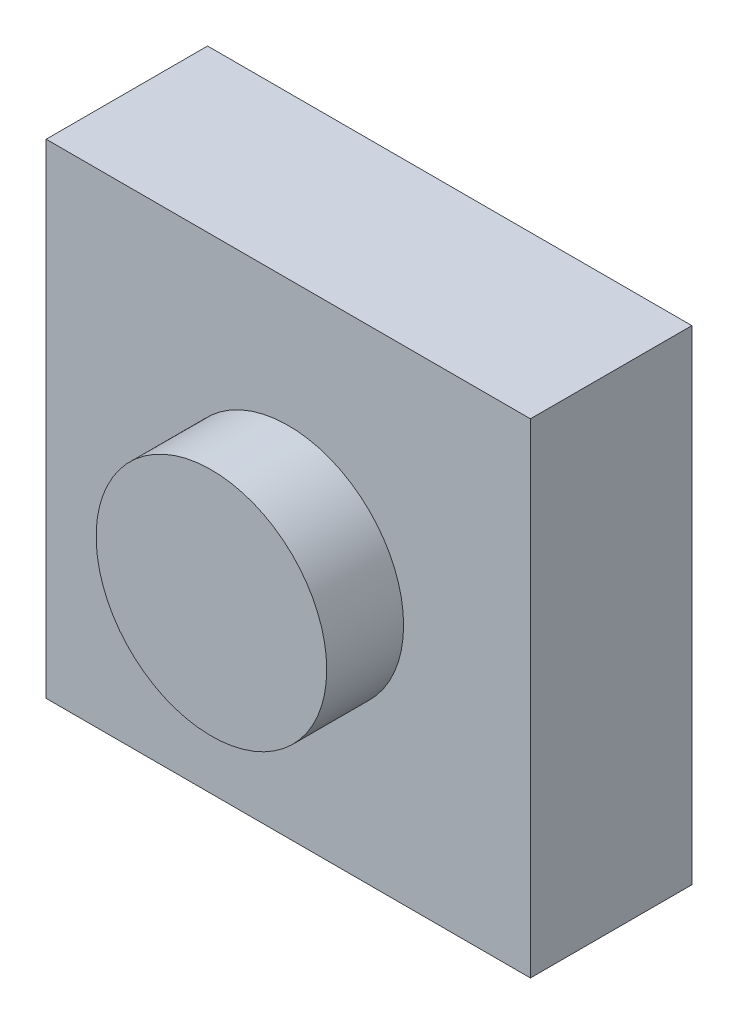
ISO-10303-21;
HEADER;
FILE_DESCRIPTION(('STEP AP214'),'2;1');
FILE_NAME('part.step','',(''),(''),'','','');
FILE_SCHEMA(('AUTOMOTIVE_DESIGN { 1 0 10303 214 1 1 1 1 }'));
ENDSEC;
DATA;
#1=APPLICATION_CONTEXT('core data for automotive mechanical design processes');
#2=APPLICATION_PROTOCOL_DEFINITION('international standard','automotive_design',2000,#1);
#3=PRODUCT_CONTEXT('',#1,'mechanical');
#4=PRODUCT('Part','Part','',(#3));
#5=PRODUCT_RELATED_PRODUCT_CATEGORY('part','',(#4));
#6=PRODUCT_DEFINITION_FORMATION('','',#4);
#7=PRODUCT_DEFINITION_CONTEXT('part definition',#1,'design');
#8=PRODUCT_DEFINITION('design','',#6,#7);
#9=PRODUCT_DEFINITION_SHAPE('','',#8);
#10=(LENGTH_UNIT() NAMED_UNIT(*) SI_UNIT(.MILLI.,.METRE.));
#11=(NAMED_UNIT(*) PLANE_ANGLE_UNIT() SI_UNIT($,.RADIAN.));
#12=(NAMED_UNIT(*) SI_UNIT($,.STERADIAN.) SOLID_ANGLE_UNIT());
#13=UNCERTAINTY_MEASURE_WITH_UNIT(LENGTH_MEASURE(1.E-05),#10,'distance_accuracy_value','');
#14=(GEOMETRIC_REPRESENTATION_CONTEXT(3) GLOBAL_UNCERTAINTY_ASSIGNED_CONTEXT((#13)) GLOBAL_UNIT_ASSIGNED_CONTEXT((#10,
#11,#12)) REPRESENTATION_CONTEXT('',''));
#15=CARTESIAN_POINT('',(0.,0.,0.));
#16=DIRECTION('',(0.,0.,1.));
#17=DIRECTION('',(1.,0.,0.));
#18=AXIS2_PLACEMENT_3D('',#15,#16,#17);
#19=CARTESIAN_POINT('',(-3.15,-3.15,2.1));
#20=DIRECTION('',(1.,0.,0.));
#21=DIRECTION('',(0.,0.,-1.));
#22=AXIS2_PLACEMENT_3D('',#19,#20,#21);
#23=PLANE('',#22);
#24=DIRECTION('',(0.,-1.,0.));
#25=VECTOR('',#24,1.);
#26=CARTESIAN_POINT('',(-3.15,-3.15,0.));
#27=LINE('',#26,#25);
#28=CARTESIAN_POINT('',(-3.15,3.15,0.));
#29=VERTEX_POINT('',#28);
#30=CARTESIAN_POINT('',(-3.15,-3.15,0.));
#31=VERTEX_POINT('',#30);
#32=EDGE_CURVE('E110',#29,#31,#27,.T.);
#33=ORIENTED_EDGE('',*,*,#32,.T.);
#34=DIRECTION('',(0.,0.,-1.));
#35=VECTOR('',#34,1.);
#36=CARTESIAN_POINT('',(-3.15,-3.15,2.1));
#37=LINE('',#36,#35);
#38=CARTESIAN_POINT('',(-3.15,-3.15,2.1));
#39=VERTEX_POINT('',#38);
#40=EDGE_CURVE('E42',#39,#31,#37,.T.);
#41=ORIENTED_EDGE('',*,*,#40,.F.);
#42=DIRECTION('',(0.,-1.,0.));
#43=VECTOR('',#42,1.);
#44=CARTESIAN_POINT('',(-3.15,-3.15,2.1));
#45=LINE('',#44,#43);
#46=CARTESIAN_POINT('',(-3.15,3.15,2.1));
#47=VERTEX_POINT('',#46);
#48=EDGE_CURVE('E93',#47,#39,#45,.T.);
#49=ORIENTED_EDGE('',*,*,#48,.F.);
#50=DIRECTION('',(0.,0.,-1.));
#51=VECTOR('',#50,1.);
#52=CARTESIAN_POINT('',(-3.15,3.15,2.1));
#53=LINE('',#52,#51);
#54=EDGE_CURVE('E106',#47,#29,#53,.T.);
#55=ORIENTED_EDGE('',*,*,#54,.T.);
#56=EDGE_LOOP('',(#33,#41,#49,#55));
#57=FACE_BOUND('',#56,.T.);
#58=ADVANCED_FACE('F39',(#57),#23,.F.);
#59=CARTESIAN_POINT('',(3.15,-3.15,2.1));
#60=DIRECTION('',(0.,1.,0.));
#61=DIRECTION('',(-1.,0.,0.));
#62=AXIS2_PLACEMENT_3D('',#59,#60,#61);
#63=PLANE('',#62);
#64=DIRECTION('',(1.,0.,0.));
#65=VECTOR('',#64,1.);
#66=CARTESIAN_POINT('',(3.15,-3.15,0.));
#67=LINE('',#66,#65);
#68=CARTESIAN_POINT('',(3.15,-3.15,0.));
#69=VERTEX_POINT('',#68);
#70=EDGE_CURVE('E99',#31,#69,#67,.T.);
#71=ORIENTED_EDGE('',*,*,#70,.T.);
#72=DIRECTION('',(0.,0.,-1.));
#73=VECTOR('',#72,1.);
#74=CARTESIAN_POINT('',(3.15,-3.15,2.1));
#75=LINE('',#74,#73);
#76=CARTESIAN_POINT('',(3.15,-3.15,2.1));
#77=VERTEX_POINT('',#76);
#78=EDGE_CURVE('E97',#77,#69,#75,.T.);
#79=ORIENTED_EDGE('',*,*,#78,.F.);
#80=DIRECTION('',(1.,0.,0.));
#81=VECTOR('',#80,1.);
#82=CARTESIAN_POINT('',(3.15,-3.15,2.1));
#83=LINE('',#82,#81);
#84=EDGE_CURVE('E88',#39,#77,#83,.T.);
#85=ORIENTED_EDGE('',*,*,#84,.F.);
#86=ORIENTED_EDGE('',*,*,#40,.T.);
#87=EDGE_LOOP('',(#71,#79,#85,#86));
#88=FACE_BOUND('',#87,.T.);
#89=ADVANCED_FACE('F98',(#88),#63,.F.);
#90=CARTESIAN_POINT('',(3.15,-3.15,2.1));
#91=DIRECTION('',(-1.,0.,0.));
#92=DIRECTION('',(0.,0.,1.));
#93=AXIS2_PLACEMENT_3D('',#90,#91,#92);
#94=PLANE('',#93);
#95=DIRECTION('',(0.,1.,0.));
#96=VECTOR('',#95,1.);
#97=CARTESIAN_POINT('',(3.15,-3.15,0.));
#98=LINE('',#97,#96);
#99=CARTESIAN_POINT('',(3.15,3.15,0.));
#100=VERTEX_POINT('',#99);
#101=EDGE_CURVE('E74',#69,#100,#98,.T.);
#102=ORIENTED_EDGE('',*,*,#101,.T.);
#103=DIRECTION('',(0.,0.,-1.));
#104=VECTOR('',#103,1.);
#105=CARTESIAN_POINT('',(3.15,3.15,2.1));
#106=LINE('',#105,#104);
#107=CARTESIAN_POINT('',(3.15,3.15,2.1));
#108=VERTEX_POINT('',#107);
#109=EDGE_CURVE('E101',#108,#100,#106,.T.);
#110=ORIENTED_EDGE('',*,*,#109,.F.);
#111=DIRECTION('',(0.,1.,0.));
#112=VECTOR('',#111,1.);
#113=CARTESIAN_POINT('',(3.15,-3.15,2.1));
#114=LINE('',#113,#112);
#115=EDGE_CURVE('E91',#77,#108,#114,.T.);
#116=ORIENTED_EDGE('',*,*,#115,.F.);
#117=ORIENTED_EDGE('',*,*,#78,.T.);
#118=EDGE_LOOP('',(#102,#110,#116,#117));
#119=FACE_BOUND('',#118,.T.);
#120=ADVANCED_FACE('F102',(#119),#94,.F.);
#121=CARTESIAN_POINT('',(3.15,3.15,2.1));
#122=DIRECTION('',(0.,-1.,0.));
#123=DIRECTION('',(1.,0.,0.));
#124=AXIS2_PLACEMENT_3D('',#121,#122,#123);
#125=PLANE('',#124);
#126=DIRECTION('',(-1.,0.,0.));
#127=VECTOR('',#126,1.);
#128=CARTESIAN_POINT('',(3.15,3.15,0.));
#129=LINE('',#128,#127);
#130=EDGE_CURVE('E80',#100,#29,#129,.T.);
#131=ORIENTED_EDGE('',*,*,#130,.T.);
#132=ORIENTED_EDGE('',*,*,#54,.F.);
#133=DIRECTION('',(-1.,0.,0.));
#134=VECTOR('',#133,1.);
#135=CARTESIAN_POINT('',(3.15,3.15,2.1));
#136=LINE('',#135,#134);
#137=EDGE_CURVE('E57',#108,#47,#136,.T.);
#138=ORIENTED_EDGE('',*,*,#137,.F.);
#139=ORIENTED_EDGE('',*,*,#109,.T.);
#140=EDGE_LOOP('',(#131,#132,#138,#139));
#141=FACE_BOUND('',#140,.T.);
#142=ADVANCED_FACE('F124',(#141),#125,.F.);
#143=CARTESIAN_POINT('',(0.,0.,2.1));
#144=DIRECTION('',(0.,0.,1.));
#145=DIRECTION('',(1.,0.,0.));
#146=AXIS2_PLACEMENT_3D('',#143,#144,#145);
#147=PLANE('',#146);
#148=CARTESIAN_POINT('',(0.,0.,2.1));
#149=DIRECTION('',(0.,0.,1.));
#150=DIRECTION('',(1.,0.,0.));
#151=AXIS2_PLACEMENT_3D('',#148,#149,#150);
#152=CIRCLE('',#151,1.5);
#153=CARTESIAN_POINT('',(1.5,0.,2.1));
#154=VERTEX_POINT('',#153);
#155=EDGE_CURVE('E11',#154,#154,#152,.T.);
#156=ORIENTED_EDGE('',*,*,#155,.F.);
#157=EDGE_LOOP('',(#156));
#158=FACE_BOUND('',#157,.T.);
#159=ORIENTED_EDGE('',*,*,#48,.T.);
#160=ORIENTED_EDGE('',*,*,#84,.T.);
#161=ORIENTED_EDGE('',*,*,#115,.T.);
#162=ORIENTED_EDGE('',*,*,#137,.T.);
#163=EDGE_LOOP('',(#159,#160,#161,#162));
#164=FACE_BOUND('',#163,.T.);
#165=ADVANCED_FACE('F89',(#158,#164),#147,.T.);
#166=CARTESIAN_POINT('',(0.,0.,0.));
#167=DIRECTION('',(0.,0.,1.));
#168=DIRECTION('',(1.,0.,0.));
#169=AXIS2_PLACEMENT_3D('',#166,#167,#168);
#170=PLANE('',#169);
#171=ORIENTED_EDGE('',*,*,#32,.F.);
#172=ORIENTED_EDGE('',*,*,#130,.F.);
#173=ORIENTED_EDGE('',*,*,#101,.F.);
#174=ORIENTED_EDGE('',*,*,#70,.F.);
#175=EDGE_LOOP('',(#171,#172,#173,#174));
#176=FACE_BOUND('',#175,.T.);
#177=ADVANCED_FACE('F127',(#176),#170,.F.);
#178=CARTESIAN_POINT('',(0.,0.,3.1));
#179=DIRECTION('',(0.,0.,-1.));
#180=DIRECTION('',(-1.,0.,0.));
#181=AXIS2_PLACEMENT_3D('',#178,#179,#180);
#182=CYLINDRICAL_SURFACE('',#181,1.5);
#183=CARTESIAN_POINT('',(0.,0.,3.1));
#184=DIRECTION('',(0.,0.,1.));
#185=DIRECTION('',(1.,0.,0.));
#186=AXIS2_PLACEMENT_3D('',#183,#184,#185);
#187=CIRCLE('',#186,1.5);
#188=CARTESIAN_POINT('',(1.5,0.,3.1));
#189=VERTEX_POINT('',#188);
#190=EDGE_CURVE('E114',#189,#189,#187,.T.);
#191=ORIENTED_EDGE('',*,*,#190,.F.);
#192=EDGE_LOOP('',(#191));
#193=FACE_BOUND('',#192,.T.);
#194=ORIENTED_EDGE('',*,*,#155,.T.);
#195=EDGE_LOOP('',(#194));
#196=FACE_BOUND('',#195,.T.);
#197=ADVANCED_FACE('F137',(#193,#196),#182,.T.);
#198=CARTESIAN_POINT('',(0.,0.,3.1));
#199=DIRECTION('',(0.,0.,1.));
#200=DIRECTION('',(1.,0.,0.));
#201=AXIS2_PLACEMENT_3D('',#198,#199,#200);
#202=PLANE('',#201);
#203=ORIENTED_EDGE('',*,*,#190,.T.);
#204=EDGE_LOOP('',(#203));
#205=FACE_BOUND('',#204,.T.);
#206=ADVANCED_FACE('F135',(#205),#202,.T.);
#207=CLOSED_SHELL('',(#58,#89,#120,#142,#165,#177,#197,#206));
#208=MANIFOLD_SOLID_BREP('B2',#207);
#209=ADVANCED_BREP_SHAPE_REPRESENTATION('',(#18,#208),#14);
#210=SHAPE_DEFINITION_REPRESENTATION(#9,#209);
ENDSEC;
END-ISO-10303-21;
